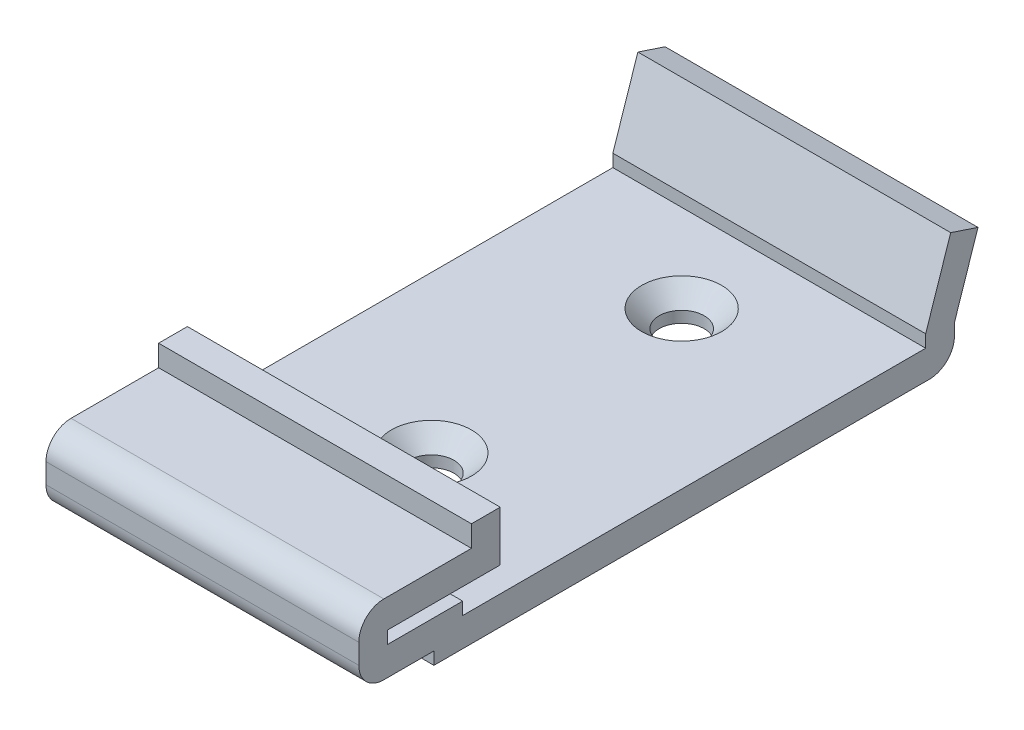
ISO-10303-21;
HEADER;
FILE_DESCRIPTION(('STEP AP214'),'2;1');
FILE_NAME('part.step','',(''),(''),'','','');
FILE_SCHEMA(('AUTOMOTIVE_DESIGN { 1 0 10303 214 1 1 1 1 }'));
ENDSEC;
DATA;
#1=APPLICATION_CONTEXT('core data for automotive mechanical design processes');
#2=APPLICATION_PROTOCOL_DEFINITION('international standard','automotive_design',2000,#1);
#3=PRODUCT_CONTEXT('',#1,'mechanical');
#4=PRODUCT('Part','Part','',(#3));
#5=PRODUCT_RELATED_PRODUCT_CATEGORY('part','',(#4));
#6=PRODUCT_DEFINITION_FORMATION('','',#4);
#7=PRODUCT_DEFINITION_CONTEXT('part definition',#1,'design');
#8=PRODUCT_DEFINITION('design','',#6,#7);
#9=PRODUCT_DEFINITION_SHAPE('','',#8);
#10=(LENGTH_UNIT() NAMED_UNIT(*) SI_UNIT(.MILLI.,.METRE.));
#11=(NAMED_UNIT(*) PLANE_ANGLE_UNIT() SI_UNIT($,.RADIAN.));
#12=(NAMED_UNIT(*) SI_UNIT($,.STERADIAN.) SOLID_ANGLE_UNIT());
#13=UNCERTAINTY_MEASURE_WITH_UNIT(LENGTH_MEASURE(1.E-05),#10,'distance_accuracy_value','');
#14=(GEOMETRIC_REPRESENTATION_CONTEXT(3) GLOBAL_UNCERTAINTY_ASSIGNED_CONTEXT((#13)) GLOBAL_UNIT_ASSIGNED_CONTEXT((#10,
#11,#12)) REPRESENTATION_CONTEXT('',''));
#15=CARTESIAN_POINT('',(0.,0.,0.));
#16=DIRECTION('',(0.,0.,1.));
#17=DIRECTION('',(1.,0.,0.));
#18=AXIS2_PLACEMENT_3D('',#15,#16,#17);
#19=CARTESIAN_POINT('',(5.,4.,0.));
#20=DIRECTION('',(0.,-1.,0.));
#21=DIRECTION('',(0.,0.,-1.));
#22=AXIS2_PLACEMENT_3D('',#19,#20,#21);
#23=PLANE('',#22);
#24=DIRECTION('',(0.,0.,1.));
#25=VECTOR('',#24,1.);
#26=CARTESIAN_POINT('',(-5.,4.,0.));
#27=LINE('',#26,#25);
#28=CARTESIAN_POINT('',(-5.,4.,0.));
#29=VERTEX_POINT('',#28);
#30=CARTESIAN_POINT('',(-5.,4.,2.3));
#31=VERTEX_POINT('',#30);
#32=EDGE_CURVE('E264',#29,#31,#27,.T.);
#33=ORIENTED_EDGE('',*,*,#32,.T.);
#34=DIRECTION('',(-1.,0.,0.));
#35=VECTOR('',#34,1.);
#36=CARTESIAN_POINT('',(5.,4.,2.3));
#37=LINE('',#36,#35);
#38=CARTESIAN_POINT('',(20.,4.,2.3));
#39=VERTEX_POINT('',#38);
#40=EDGE_CURVE('E336',#39,#31,#37,.T.);
#41=ORIENTED_EDGE('',*,*,#40,.F.);
#42=DIRECTION('',(0.,0.,1.));
#43=VECTOR('',#42,1.);
#44=CARTESIAN_POINT('',(20.,4.,0.));
#45=LINE('',#44,#43);
#46=CARTESIAN_POINT('',(20.,4.,0.));
#47=VERTEX_POINT('',#46);
#48=EDGE_CURVE('E246',#47,#39,#45,.T.);
#49=ORIENTED_EDGE('',*,*,#48,.F.);
#50=DIRECTION('',(-1.,0.,0.));
#51=VECTOR('',#50,1.);
#52=CARTESIAN_POINT('',(5.,4.,0.));
#53=LINE('',#52,#51);
#54=EDGE_CURVE('E300',#47,#29,#53,.T.);
#55=ORIENTED_EDGE('',*,*,#54,.T.);
#56=EDGE_LOOP('',(#33,#41,#49,#55));
#57=FACE_BOUND('',#56,.T.);
#58=ADVANCED_FACE('F34',(#57),#23,.F.);
#59=CARTESIAN_POINT('',(5.,4.,2.3));
#60=DIRECTION('',(0.,0.,-1.));
#61=DIRECTION('',(-1.,0.,0.));
#62=AXIS2_PLACEMENT_3D('',#59,#60,#61);
#63=PLANE('',#62);
#64=DIRECTION('',(0.,-1.,0.));
#65=VECTOR('',#64,1.);
#66=CARTESIAN_POINT('',(-5.,4.,2.3));
#67=LINE('',#66,#65);
#68=CARTESIAN_POINT('',(-5.,2.3,2.3));
#69=VERTEX_POINT('',#68);
#70=EDGE_CURVE('E267',#31,#69,#67,.T.);
#71=ORIENTED_EDGE('',*,*,#70,.T.);
#72=DIRECTION('',(-1.,0.,0.));
#73=VECTOR('',#72,1.);
#74=CARTESIAN_POINT('',(5.,2.3,2.3));
#75=LINE('',#74,#73);
#76=CARTESIAN_POINT('',(20.,2.3,2.3));
#77=VERTEX_POINT('',#76);
#78=EDGE_CURVE('E333',#77,#69,#75,.T.);
#79=ORIENTED_EDGE('',*,*,#78,.F.);
#80=DIRECTION('',(0.,-1.,0.));
#81=VECTOR('',#80,1.);
#82=CARTESIAN_POINT('',(20.,4.,2.3));
#83=LINE('',#82,#81);
#84=EDGE_CURVE('E249',#39,#77,#83,.T.);
#85=ORIENTED_EDGE('',*,*,#84,.F.);
#86=ORIENTED_EDGE('',*,*,#40,.T.);
#87=EDGE_LOOP('',(#71,#79,#85,#86));
#88=FACE_BOUND('',#87,.T.);
#89=ADVANCED_FACE('F415',(#88),#63,.F.);
#90=CARTESIAN_POINT('',(5.,2.3,2.3));
#91=DIRECTION('',(0.,-1.,0.));
#92=DIRECTION('',(0.,0.,-1.));
#93=AXIS2_PLACEMENT_3D('',#90,#91,#92);
#94=PLANE('',#93);
#95=DIRECTION('',(0.,0.,1.));
#96=VECTOR('',#95,1.);
#97=CARTESIAN_POINT('',(-5.,2.3,2.3));
#98=LINE('',#97,#96);
#99=CARTESIAN_POINT('',(-5.,2.3,9.3));
#100=VERTEX_POINT('',#99);
#101=EDGE_CURVE('E269',#69,#100,#98,.T.);
#102=ORIENTED_EDGE('',*,*,#101,.T.);
#103=DIRECTION('',(-1.,0.,0.));
#104=VECTOR('',#103,1.);
#105=CARTESIAN_POINT('',(5.,2.3,9.3));
#106=LINE('',#105,#104);
#107=CARTESIAN_POINT('',(20.,2.3,9.3));
#108=VERTEX_POINT('',#107);
#109=EDGE_CURVE('E11',#100,#108,#106,.F.);
#110=ORIENTED_EDGE('',*,*,#109,.T.);
#111=DIRECTION('',(0.,0.,1.));
#112=VECTOR('',#111,1.);
#113=CARTESIAN_POINT('',(20.,2.3,2.3));
#114=LINE('',#113,#112);
#115=EDGE_CURVE('E252',#77,#108,#114,.T.);
#116=ORIENTED_EDGE('',*,*,#115,.F.);
#117=ORIENTED_EDGE('',*,*,#78,.T.);
#118=EDGE_LOOP('',(#102,#110,#116,#117));
#119=FACE_BOUND('',#118,.T.);
#120=ADVANCED_FACE('F417',(#119),#94,.F.);
#121=CARTESIAN_POINT('',(5.,2.3,11.3));
#122=DIRECTION('',(0.,0.,-1.));
#123=DIRECTION('',(-1.,0.,0.));
#124=AXIS2_PLACEMENT_3D('',#121,#122,#123);
#125=PLANE('',#124);
#126=DIRECTION('',(0.,-1.,0.));
#127=VECTOR('',#126,1.);
#128=CARTESIAN_POINT('',(-5.,2.3,11.3));
#129=LINE('',#128,#127);
#130=CARTESIAN_POINT('',(-5.,0.3,11.3));
#131=VERTEX_POINT('',#130);
#132=CARTESIAN_POINT('',(-5.,-1.3,11.3));
#133=VERTEX_POINT('',#132);
#134=EDGE_CURVE('E271',#131,#133,#129,.T.);
#135=ORIENTED_EDGE('',*,*,#134,.T.);
#136=DIRECTION('',(-1.,0.,0.));
#137=VECTOR('',#136,1.);
#138=CARTESIAN_POINT('',(5.,-1.3,11.3));
#139=LINE('',#138,#137);
#140=CARTESIAN_POINT('',(20.,-1.3,11.3));
#141=VERTEX_POINT('',#140);
#142=EDGE_CURVE('E42',#133,#141,#139,.F.);
#143=ORIENTED_EDGE('',*,*,#142,.T.);
#144=DIRECTION('',(0.,-1.,0.));
#145=VECTOR('',#144,1.);
#146=CARTESIAN_POINT('',(20.,0.3,11.3));
#147=LINE('',#146,#145);
#148=CARTESIAN_POINT('',(20.,0.3,11.3));
#149=VERTEX_POINT('',#148);
#150=EDGE_CURVE('E258',#149,#141,#147,.T.);
#151=ORIENTED_EDGE('',*,*,#150,.F.);
#152=DIRECTION('',(-1.,0.,0.));
#153=VECTOR('',#152,1.);
#154=CARTESIAN_POINT('',(5.,0.3,11.3));
#155=LINE('',#154,#153);
#156=EDGE_CURVE('E350',#149,#131,#155,.T.);
#157=ORIENTED_EDGE('',*,*,#156,.T.);
#158=EDGE_LOOP('',(#135,#143,#151,#157));
#159=FACE_BOUND('',#158,.T.);
#160=ADVANCED_FACE('F355',(#159),#125,.F.);
#161=CARTESIAN_POINT('',(5.,-3.3,11.3));
#162=DIRECTION('',(0.,1.,0.));
#163=DIRECTION('',(0.,0.,1.));
#164=AXIS2_PLACEMENT_3D('',#161,#162,#163);
#165=PLANE('',#164);
#166=DIRECTION('',(-1.,0.,0.));
#167=VECTOR('',#166,1.);
#168=CARTESIAN_POINT('',(5.,-3.3,5.3));
#169=LINE('',#168,#167);
#170=CARTESIAN_POINT('',(20.,-3.3,5.3));
#171=VERTEX_POINT('',#170);
#172=CARTESIAN_POINT('',(-5.,-3.3,5.3));
#173=VERTEX_POINT('',#172);
#174=EDGE_CURVE('E187',#171,#173,#169,.T.);
#175=ORIENTED_EDGE('',*,*,#174,.F.);
#176=DIRECTION('',(0.,0.,-1.));
#177=VECTOR('',#176,1.);
#178=CARTESIAN_POINT('',(20.,-3.3,9.3));
#179=LINE('',#178,#177);
#180=CARTESIAN_POINT('',(20.,-3.3,9.3));
#181=VERTEX_POINT('',#180);
#182=EDGE_CURVE('E204',#181,#171,#179,.T.);
#183=ORIENTED_EDGE('',*,*,#182,.F.);
#184=DIRECTION('',(-1.,0.,0.));
#185=VECTOR('',#184,1.);
#186=CARTESIAN_POINT('',(5.,-3.3,9.3));
#187=LINE('',#186,#185);
#188=CARTESIAN_POINT('',(-5.,-3.3,9.3));
#189=VERTEX_POINT('',#188);
#190=EDGE_CURVE('E347',#181,#189,#187,.T.);
#191=ORIENTED_EDGE('',*,*,#190,.T.);
#192=DIRECTION('',(0.,0.,-1.));
#193=VECTOR('',#192,1.);
#194=CARTESIAN_POINT('',(-5.,-3.3,11.3));
#195=LINE('',#194,#193);
#196=EDGE_CURVE('E273',#189,#173,#195,.T.);
#197=ORIENTED_EDGE('',*,*,#196,.T.);
#198=EDGE_LOOP('',(#175,#183,#191,#197));
#199=FACE_BOUND('',#198,.T.);
#200=ADVANCED_FACE('F361',(#199),#165,.F.);
#201=CARTESIAN_POINT('',(5.,-3.3,5.3));
#202=DIRECTION('',(0.,0.,-1.));
#203=DIRECTION('',(-1.,0.,0.));
#204=AXIS2_PLACEMENT_3D('',#201,#202,#203);
#205=PLANE('',#204);
#206=DIRECTION('',(0.,-1.,0.));
#207=VECTOR('',#206,1.);
#208=CARTESIAN_POINT('',(-5.,-3.3,5.3));
#209=LINE('',#208,#207);
#210=CARTESIAN_POINT('',(-5.,-4.3,5.3));
#211=VERTEX_POINT('',#210);
#212=EDGE_CURVE('E183',#173,#211,#209,.T.);
#213=ORIENTED_EDGE('',*,*,#212,.T.);
#214=DIRECTION('',(-1.,0.,0.));
#215=VECTOR('',#214,1.);
#216=CARTESIAN_POINT('',(5.,-4.3,5.3));
#217=LINE('',#216,#215);
#218=CARTESIAN_POINT('',(20.,-4.3,5.3));
#219=VERTEX_POINT('',#218);
#220=EDGE_CURVE('E176',#219,#211,#217,.T.);
#221=ORIENTED_EDGE('',*,*,#220,.F.);
#222=DIRECTION('',(0.,-1.,0.));
#223=VECTOR('',#222,1.);
#224=CARTESIAN_POINT('',(20.,-3.3,5.3));
#225=LINE('',#224,#223);
#226=EDGE_CURVE('E181',#171,#219,#225,.T.);
#227=ORIENTED_EDGE('',*,*,#226,.F.);
#228=ORIENTED_EDGE('',*,*,#174,.T.);
#229=EDGE_LOOP('',(#213,#221,#227,#228));
#230=FACE_BOUND('',#229,.T.);
#231=ADVANCED_FACE('F178',(#230),#205,.F.);
#232=CARTESIAN_POINT('',(5.,-4.3,5.3));
#233=DIRECTION('',(0.,1.,0.));
#234=DIRECTION('',(0.,0.,1.));
#235=AXIS2_PLACEMENT_3D('',#232,#233,#234);
#236=PLANE('',#235);
#237=CARTESIAN_POINT('',(7.5,-4.3,-27.));
#238=DIRECTION('',(0.,1.,0.));
#239=DIRECTION('',(0.,0.,1.));
#240=AXIS2_PLACEMENT_3D('',#237,#238,#239);
#241=CIRCLE('',#240,1.8);
#242=CARTESIAN_POINT('',(7.5,-4.3,-25.2));
#243=VERTEX_POINT('',#242);
#244=EDGE_CURVE('E614',#243,#243,#241,.T.);
#245=ORIENTED_EDGE('',*,*,#244,.T.);
#246=EDGE_LOOP('',(#245));
#247=FACE_BOUND('',#246,.T.);
#248=CARTESIAN_POINT('',(7.5,-4.3,-7.));
#249=DIRECTION('',(0.,1.,0.));
#250=DIRECTION('',(0.,0.,1.));
#251=AXIS2_PLACEMENT_3D('',#248,#249,#250);
#252=CIRCLE('',#251,1.8);
#253=CARTESIAN_POINT('',(7.5,-4.3,-5.2));
#254=VERTEX_POINT('',#253);
#255=EDGE_CURVE('E205',#254,#254,#252,.T.);
#256=ORIENTED_EDGE('',*,*,#255,.T.);
#257=EDGE_LOOP('',(#256));
#258=FACE_BOUND('',#257,.T.);
#259=DIRECTION('',(0.,0.,-1.));
#260=VECTOR('',#259,1.);
#261=CARTESIAN_POINT('',(-5.,-4.3,5.3));
#262=LINE('',#261,#260);
#263=CARTESIAN_POINT('',(-5.,-4.3,-34.3));
#264=VERTEX_POINT('',#263);
#265=EDGE_CURVE('E276',#211,#264,#262,.T.);
#266=ORIENTED_EDGE('',*,*,#265,.T.);
#267=DIRECTION('',(-1.,0.,0.));
#268=VECTOR('',#267,1.);
#269=CARTESIAN_POINT('',(5.,-4.3,-34.3));
#270=LINE('',#269,#268);
#271=CARTESIAN_POINT('',(20.,-4.3,-34.3));
#272=VERTEX_POINT('',#271);
#273=EDGE_CURVE('E194',#264,#272,#270,.F.);
#274=ORIENTED_EDGE('',*,*,#273,.T.);
#275=DIRECTION('',(0.,0.,-1.));
#276=VECTOR('',#275,1.);
#277=CARTESIAN_POINT('',(20.,-4.3,5.3));
#278=LINE('',#277,#276);
#279=EDGE_CURVE('E191',#219,#272,#278,.T.);
#280=ORIENTED_EDGE('',*,*,#279,.F.);
#281=ORIENTED_EDGE('',*,*,#220,.T.);
#282=EDGE_LOOP('',(#266,#274,#280,#281));
#283=FACE_BOUND('',#282,.T.);
#284=ADVANCED_FACE('F192',(#247,#258,#283),#236,.F.);
#285=CARTESIAN_POINT('',(5.,-4.3,-36.3));
#286=DIRECTION('',(0.,0.,1.));
#287=DIRECTION('',(1.,0.,0.));
#288=AXIS2_PLACEMENT_3D('',#285,#286,#287);
#289=PLANE('',#288);
#290=DIRECTION('',(-1.,0.,0.));
#291=VECTOR('',#290,1.);
#292=CARTESIAN_POINT('',(5.,-1.37323861838728,-36.3));
#293=LINE('',#292,#291);
#294=CARTESIAN_POINT('',(20.,-1.37323861838728,-36.3));
#295=VERTEX_POINT('',#294);
#296=CARTESIAN_POINT('',(-5.,-1.37323861838728,-36.3));
#297=VERTEX_POINT('',#296);
#298=EDGE_CURVE('E188',#295,#297,#293,.T.);
#299=ORIENTED_EDGE('',*,*,#298,.F.);
#300=DIRECTION('',(0.,1.,0.));
#301=VECTOR('',#300,1.);
#302=CARTESIAN_POINT('',(20.,-2.3,-36.3));
#303=LINE('',#302,#301);
#304=CARTESIAN_POINT('',(20.,-2.3,-36.3));
#305=VERTEX_POINT('',#304);
#306=EDGE_CURVE('E213',#305,#295,#303,.T.);
#307=ORIENTED_EDGE('',*,*,#306,.F.);
#308=DIRECTION('',(-1.,0.,0.));
#309=VECTOR('',#308,1.);
#310=CARTESIAN_POINT('',(5.,-2.3,-36.3));
#311=LINE('',#310,#309);
#312=CARTESIAN_POINT('',(-5.,-2.3,-36.3));
#313=VERTEX_POINT('',#312);
#314=EDGE_CURVE('E339',#305,#313,#311,.T.);
#315=ORIENTED_EDGE('',*,*,#314,.T.);
#316=DIRECTION('',(0.,1.,0.));
#317=VECTOR('',#316,1.);
#318=CARTESIAN_POINT('',(-5.,-4.3,-36.3));
#319=LINE('',#318,#317);
#320=EDGE_CURVE('E278',#313,#297,#319,.T.);
#321=ORIENTED_EDGE('',*,*,#320,.T.);
#322=EDGE_LOOP('',(#299,#307,#315,#321));
#323=FACE_BOUND('',#322,.T.);
#324=ADVANCED_FACE('F369',(#323),#289,.F.);
#325=CARTESIAN_POINT('',(5.,-1.37323861838728,-36.3));
#326=DIRECTION('',(0.,0.316227766016838,0.948683298050514));
#327=DIRECTION('',(0.,-0.948683298050514,0.316227766016838));
#328=AXIS2_PLACEMENT_3D('',#325,#326,#327);
#329=PLANE('',#328);
#330=DIRECTION('',(0.,0.948683298050514,-0.316227766016838));
#331=VECTOR('',#330,1.);
#332=CARTESIAN_POINT('',(-5.,-1.37323861838728,-36.3));
#333=LINE('',#332,#331);
#334=CARTESIAN_POINT('',(-5.,4.27267613816128,-38.1819715855162));
#335=VERTEX_POINT('',#334);
#336=EDGE_CURVE('E280',#297,#335,#333,.T.);
#337=ORIENTED_EDGE('',*,*,#336,.T.);
#338=DIRECTION('',(-1.,0.,0.));
#339=VECTOR('',#338,1.);
#340=CARTESIAN_POINT('',(5.,4.27267613816128,-38.1819715855162));
#341=LINE('',#340,#339);
#342=CARTESIAN_POINT('',(20.,4.27267613816128,-38.1819715855162));
#343=VERTEX_POINT('',#342);
#344=EDGE_CURVE('E327',#343,#335,#341,.T.);
#345=ORIENTED_EDGE('',*,*,#344,.F.);
#346=DIRECTION('',(0.,0.948683298050514,-0.316227766016838));
#347=VECTOR('',#346,1.);
#348=CARTESIAN_POINT('',(20.,-1.37323861838728,-36.3));
#349=LINE('',#348,#347);
#350=EDGE_CURVE('E216',#295,#343,#349,.T.);
#351=ORIENTED_EDGE('',*,*,#350,.F.);
#352=ORIENTED_EDGE('',*,*,#298,.T.);
#353=EDGE_LOOP('',(#337,#345,#351,#352));
#354=FACE_BOUND('',#353,.T.);
#355=ADVANCED_FACE('F372',(#354),#329,.F.);
#356=CARTESIAN_POINT('',(5.,5.,-36.));
#357=DIRECTION('',(0.,-0.948683298050515,0.316227766016834));
#358=DIRECTION('',(0.,-0.316227766016834,-0.948683298050515));
#359=AXIS2_PLACEMENT_3D('',#356,#357,#358);
#360=PLANE('',#359);
#361=DIRECTION('',(0.,0.316227766016834,0.948683298050515));
#362=VECTOR('',#361,1.);
#363=CARTESIAN_POINT('',(-5.,5.,-36.));
#364=LINE('',#363,#362);
#365=CARTESIAN_POINT('',(-5.,5.,-36.));
#366=VERTEX_POINT('',#365);
#367=EDGE_CURVE('E282',#335,#366,#364,.T.);
#368=ORIENTED_EDGE('',*,*,#367,.T.);
#369=DIRECTION('',(-1.,0.,0.));
#370=VECTOR('',#369,1.);
#371=CARTESIAN_POINT('',(5.,5.,-36.));
#372=LINE('',#371,#370);
#373=CARTESIAN_POINT('',(20.,5.,-36.));
#374=VERTEX_POINT('',#373);
#375=EDGE_CURVE('E324',#374,#366,#372,.T.);
#376=ORIENTED_EDGE('',*,*,#375,.F.);
#377=DIRECTION('',(0.,0.316227766016834,0.948683298050515));
#378=VECTOR('',#377,1.);
#379=CARTESIAN_POINT('',(20.,4.27267613816128,-38.1819715855162));
#380=LINE('',#379,#378);
#381=EDGE_CURVE('E219',#343,#374,#380,.T.);
#382=ORIENTED_EDGE('',*,*,#381,.F.);
#383=ORIENTED_EDGE('',*,*,#344,.T.);
#384=EDGE_LOOP('',(#368,#376,#382,#383));
#385=FACE_BOUND('',#384,.T.);
#386=ADVANCED_FACE('F377',(#385),#360,.F.);
#387=CARTESIAN_POINT('',(5.,-1.,-34.));
#388=DIRECTION('',(0.,-0.316227766016838,-0.948683298050514));
#389=DIRECTION('',(0.,0.948683298050514,-0.316227766016838));
#390=AXIS2_PLACEMENT_3D('',#387,#388,#389);
#391=PLANE('',#390);
#392=DIRECTION('',(0.,-0.948683298050514,0.316227766016838));
#393=VECTOR('',#392,1.);
#394=CARTESIAN_POINT('',(-5.,-1.,-34.));
#395=LINE('',#394,#393);
#396=CARTESIAN_POINT('',(-5.,-1.,-34.));
#397=VERTEX_POINT('',#396);
#398=EDGE_CURVE('E284',#366,#397,#395,.T.);
#399=ORIENTED_EDGE('',*,*,#398,.T.);
#400=DIRECTION('',(-1.,0.,0.));
#401=VECTOR('',#400,1.);
#402=CARTESIAN_POINT('',(5.,-1.,-34.));
#403=LINE('',#402,#401);
#404=CARTESIAN_POINT('',(20.,-1.,-34.));
#405=VERTEX_POINT('',#404);
#406=EDGE_CURVE('E321',#405,#397,#403,.T.);
#407=ORIENTED_EDGE('',*,*,#406,.F.);
#408=DIRECTION('',(0.,-0.948683298050514,0.316227766016838));
#409=VECTOR('',#408,1.);
#410=CARTESIAN_POINT('',(20.,5.,-36.));
#411=LINE('',#410,#409);
#412=EDGE_CURVE('E222',#374,#405,#411,.T.);
#413=ORIENTED_EDGE('',*,*,#412,.F.);
#414=ORIENTED_EDGE('',*,*,#375,.T.);
#415=EDGE_LOOP('',(#399,#407,#413,#414));
#416=FACE_BOUND('',#415,.T.);
#417=ADVANCED_FACE('F381',(#416),#391,.F.);
#418=CARTESIAN_POINT('',(5.,-2.,-34.));
#419=DIRECTION('',(0.,0.,-1.));
#420=DIRECTION('',(-1.,0.,0.));
#421=AXIS2_PLACEMENT_3D('',#418,#419,#420);
#422=PLANE('',#421);
#423=DIRECTION('',(0.,-1.,0.));
#424=VECTOR('',#423,1.);
#425=CARTESIAN_POINT('',(-5.,-2.,-34.));
#426=LINE('',#425,#424);
#427=CARTESIAN_POINT('',(-5.,-2.,-34.));
#428=VERTEX_POINT('',#427);
#429=EDGE_CURVE('E286',#397,#428,#426,.T.);
#430=ORIENTED_EDGE('',*,*,#429,.T.);
#431=DIRECTION('',(-1.,0.,0.));
#432=VECTOR('',#431,1.);
#433=CARTESIAN_POINT('',(5.,-2.,-34.));
#434=LINE('',#433,#432);
#435=CARTESIAN_POINT('',(20.,-2.,-34.));
#436=VERTEX_POINT('',#435);
#437=EDGE_CURVE('E318',#436,#428,#434,.T.);
#438=ORIENTED_EDGE('',*,*,#437,.F.);
#439=DIRECTION('',(0.,-1.,0.));
#440=VECTOR('',#439,1.);
#441=CARTESIAN_POINT('',(20.,-1.,-34.));
#442=LINE('',#441,#440);
#443=EDGE_CURVE('E225',#405,#436,#442,.T.);
#444=ORIENTED_EDGE('',*,*,#443,.F.);
#445=ORIENTED_EDGE('',*,*,#406,.T.);
#446=EDGE_LOOP('',(#430,#438,#444,#445));
#447=FACE_BOUND('',#446,.T.);
#448=ADVANCED_FACE('F385',(#447),#422,.F.);
#449=CARTESIAN_POINT('',(5.,-2.,3.));
#450=DIRECTION('',(0.,-1.,0.));
#451=DIRECTION('',(0.,0.,-1.));
#452=AXIS2_PLACEMENT_3D('',#449,#450,#451);
#453=PLANE('',#452);
#454=CARTESIAN_POINT('',(7.5,-2.,-27.));
#455=DIRECTION('',(0.,1.,0.));
#456=DIRECTION('',(0.,0.,1.));
#457=AXIS2_PLACEMENT_3D('',#454,#455,#456);
#458=CIRCLE('',#457,3.2);
#459=CARTESIAN_POINT('',(7.5,-2.,-23.8));
#460=VERTEX_POINT('',#459);
#461=EDGE_CURVE('E612',#460,#460,#458,.T.);
#462=ORIENTED_EDGE('',*,*,#461,.F.);
#463=EDGE_LOOP('',(#462));
#464=FACE_BOUND('',#463,.T.);
#465=CARTESIAN_POINT('',(7.5,-2.,-7.));
#466=DIRECTION('',(0.,1.,0.));
#467=DIRECTION('',(0.,0.,1.));
#468=AXIS2_PLACEMENT_3D('',#465,#466,#467);
#469=CIRCLE('',#468,3.2);
#470=CARTESIAN_POINT('',(7.5,-2.,-3.8));
#471=VERTEX_POINT('',#470);
#472=EDGE_CURVE('E619',#471,#471,#469,.T.);
#473=ORIENTED_EDGE('',*,*,#472,.F.);
#474=EDGE_LOOP('',(#473));
#475=FACE_BOUND('',#474,.T.);
#476=DIRECTION('',(0.,0.,1.));
#477=VECTOR('',#476,1.);
#478=CARTESIAN_POINT('',(-5.,-2.,3.));
#479=LINE('',#478,#477);
#480=CARTESIAN_POINT('',(-5.,-2.,3.));
#481=VERTEX_POINT('',#480);
#482=EDGE_CURVE('E288',#428,#481,#479,.T.);
#483=ORIENTED_EDGE('',*,*,#482,.T.);
#484=DIRECTION('',(-1.,0.,0.));
#485=VECTOR('',#484,1.);
#486=CARTESIAN_POINT('',(5.,-2.,3.));
#487=LINE('',#486,#485);
#488=CARTESIAN_POINT('',(20.,-2.,3.));
#489=VERTEX_POINT('',#488);
#490=EDGE_CURVE('E315',#489,#481,#487,.T.);
#491=ORIENTED_EDGE('',*,*,#490,.F.);
#492=DIRECTION('',(0.,0.,1.));
#493=VECTOR('',#492,1.);
#494=CARTESIAN_POINT('',(20.,-2.,-34.));
#495=LINE('',#494,#493);
#496=EDGE_CURVE('E228',#436,#489,#495,.T.);
#497=ORIENTED_EDGE('',*,*,#496,.F.);
#498=ORIENTED_EDGE('',*,*,#437,.T.);
#499=EDGE_LOOP('',(#483,#491,#497,#498));
#500=FACE_BOUND('',#499,.T.);
#501=ADVANCED_FACE('F388',(#464,#475,#500),#453,.F.);
#502=CARTESIAN_POINT('',(5.,-1.,3.));
#503=DIRECTION('',(0.,0.,1.));
#504=DIRECTION('',(0.,-1.,0.));
#505=AXIS2_PLACEMENT_3D('',#502,#503,#504);
#506=PLANE('',#505);
#507=DIRECTION('',(0.,1.,0.));
#508=VECTOR('',#507,1.);
#509=CARTESIAN_POINT('',(-5.,-1.,3.));
#510=LINE('',#509,#508);
#511=CARTESIAN_POINT('',(-5.,-1.,3.));
#512=VERTEX_POINT('',#511);
#513=EDGE_CURVE('E290',#481,#512,#510,.T.);
#514=ORIENTED_EDGE('',*,*,#513,.T.);
#515=DIRECTION('',(-1.,0.,0.));
#516=VECTOR('',#515,1.);
#517=CARTESIAN_POINT('',(5.,-1.,3.));
#518=LINE('',#517,#516);
#519=CARTESIAN_POINT('',(20.,-1.,3.));
#520=VERTEX_POINT('',#519);
#521=EDGE_CURVE('E312',#520,#512,#518,.T.);
#522=ORIENTED_EDGE('',*,*,#521,.F.);
#523=DIRECTION('',(0.,1.,0.));
#524=VECTOR('',#523,1.);
#525=CARTESIAN_POINT('',(20.,-2.,3.));
#526=LINE('',#525,#524);
#527=EDGE_CURVE('E231',#489,#520,#526,.T.);
#528=ORIENTED_EDGE('',*,*,#527,.F.);
#529=ORIENTED_EDGE('',*,*,#490,.T.);
#530=EDGE_LOOP('',(#514,#522,#528,#529));
#531=FACE_BOUND('',#530,.T.);
#532=ADVANCED_FACE('F393',(#531),#506,.F.);
#533=CARTESIAN_POINT('',(5.,-1.,9.));
#534=DIRECTION('',(0.,-1.,0.));
#535=DIRECTION('',(0.,0.,-1.));
#536=AXIS2_PLACEMENT_3D('',#533,#534,#535);
#537=PLANE('',#536);
#538=DIRECTION('',(0.,0.,1.));
#539=VECTOR('',#538,1.);
#540=CARTESIAN_POINT('',(-5.,-1.,9.));
#541=LINE('',#540,#539);
#542=CARTESIAN_POINT('',(-5.,-1.,9.));
#543=VERTEX_POINT('',#542);
#544=EDGE_CURVE('E292',#512,#543,#541,.T.);
#545=ORIENTED_EDGE('',*,*,#544,.T.);
#546=DIRECTION('',(-1.,0.,0.));
#547=VECTOR('',#546,1.);
#548=CARTESIAN_POINT('',(5.,-1.,9.));
#549=LINE('',#548,#547);
#550=CARTESIAN_POINT('',(20.,-1.,9.));
#551=VERTEX_POINT('',#550);
#552=EDGE_CURVE('E309',#551,#543,#549,.T.);
#553=ORIENTED_EDGE('',*,*,#552,.F.);
#554=DIRECTION('',(0.,0.,1.));
#555=VECTOR('',#554,1.);
#556=CARTESIAN_POINT('',(20.,-1.,3.));
#557=LINE('',#556,#555);
#558=EDGE_CURVE('E234',#520,#551,#557,.T.);
#559=ORIENTED_EDGE('',*,*,#558,.F.);
#560=ORIENTED_EDGE('',*,*,#521,.T.);
#561=EDGE_LOOP('',(#545,#553,#559,#560));
#562=FACE_BOUND('',#561,.T.);
#563=ADVANCED_FACE('F397',(#562),#537,.F.);
#564=CARTESIAN_POINT('',(5.,0.,9.));
#565=DIRECTION('',(0.,0.,1.));
#566=DIRECTION('',(0.,-1.,0.));
#567=AXIS2_PLACEMENT_3D('',#564,#565,#566);
#568=PLANE('',#567);
#569=DIRECTION('',(0.,1.,0.));
#570=VECTOR('',#569,1.);
#571=CARTESIAN_POINT('',(-5.,0.,9.));
#572=LINE('',#571,#570);
#573=CARTESIAN_POINT('',(-5.,0.,9.));
#574=VERTEX_POINT('',#573);
#575=EDGE_CURVE('E294',#543,#574,#572,.T.);
#576=ORIENTED_EDGE('',*,*,#575,.T.);
#577=DIRECTION('',(-1.,0.,0.));
#578=VECTOR('',#577,1.);
#579=CARTESIAN_POINT('',(5.,0.,9.));
#580=LINE('',#579,#578);
#581=CARTESIAN_POINT('',(20.,0.,9.));
#582=VERTEX_POINT('',#581);
#583=EDGE_CURVE('E306',#582,#574,#580,.T.);
#584=ORIENTED_EDGE('',*,*,#583,.F.);
#585=DIRECTION('',(0.,1.,0.));
#586=VECTOR('',#585,1.);
#587=CARTESIAN_POINT('',(20.,-1.,9.));
#588=LINE('',#587,#586);
#589=EDGE_CURVE('E237',#551,#582,#588,.T.);
#590=ORIENTED_EDGE('',*,*,#589,.F.);
#591=ORIENTED_EDGE('',*,*,#552,.T.);
#592=EDGE_LOOP('',(#576,#584,#590,#591));
#593=FACE_BOUND('',#592,.T.);
#594=ADVANCED_FACE('F401',(#593),#568,.F.);
#595=CARTESIAN_POINT('',(5.,0.,0.));
#596=DIRECTION('',(0.,1.,0.));
#597=DIRECTION('',(0.,0.,1.));
#598=AXIS2_PLACEMENT_3D('',#595,#596,#597);
#599=PLANE('',#598);
#600=DIRECTION('',(0.,0.,-1.));
#601=VECTOR('',#600,1.);
#602=CARTESIAN_POINT('',(-5.,0.,0.));
#603=LINE('',#602,#601);
#604=CARTESIAN_POINT('',(-5.,0.,0.));
#605=VERTEX_POINT('',#604);
#606=EDGE_CURVE('E296',#574,#605,#603,.T.);
#607=ORIENTED_EDGE('',*,*,#606,.T.);
#608=DIRECTION('',(-1.,0.,0.));
#609=VECTOR('',#608,1.);
#610=CARTESIAN_POINT('',(5.,0.,0.));
#611=LINE('',#610,#609);
#612=CARTESIAN_POINT('',(20.,0.,0.));
#613=VERTEX_POINT('',#612);
#614=EDGE_CURVE('E303',#613,#605,#611,.T.);
#615=ORIENTED_EDGE('',*,*,#614,.F.);
#616=DIRECTION('',(0.,0.,-1.));
#617=VECTOR('',#616,1.);
#618=CARTESIAN_POINT('',(20.,0.,9.));
#619=LINE('',#618,#617);
#620=EDGE_CURVE('E240',#582,#613,#619,.T.);
#621=ORIENTED_EDGE('',*,*,#620,.F.);
#622=ORIENTED_EDGE('',*,*,#583,.T.);
#623=EDGE_LOOP('',(#607,#615,#621,#622));
#624=FACE_BOUND('',#623,.T.);
#625=ADVANCED_FACE('F404',(#624),#599,.F.);
#626=CARTESIAN_POINT('',(5.,4.,0.));
#627=DIRECTION('',(0.,0.,1.));
#628=DIRECTION('',(1.,0.,0.));
#629=AXIS2_PLACEMENT_3D('',#626,#627,#628);
#630=PLANE('',#629);
#631=DIRECTION('',(0.,1.,0.));
#632=VECTOR('',#631,1.);
#633=CARTESIAN_POINT('',(-5.,4.,0.));
#634=LINE('',#633,#632);
#635=EDGE_CURVE('E298',#605,#29,#634,.T.);
#636=ORIENTED_EDGE('',*,*,#635,.T.);
#637=ORIENTED_EDGE('',*,*,#54,.F.);
#638=DIRECTION('',(0.,1.,0.));
#639=VECTOR('',#638,1.);
#640=CARTESIAN_POINT('',(20.,0.,0.));
#641=LINE('',#640,#639);
#642=EDGE_CURVE('E243',#613,#47,#641,.T.);
#643=ORIENTED_EDGE('',*,*,#642,.F.);
#644=ORIENTED_EDGE('',*,*,#614,.T.);
#645=EDGE_LOOP('',(#636,#637,#643,#644));
#646=FACE_BOUND('',#645,.T.);
#647=ADVANCED_FACE('F408',(#646),#630,.F.);
#648=CARTESIAN_POINT('',(-5.,0.,0.));
#649=DIRECTION('',(1.,0.,0.));
#650=DIRECTION('',(0.,0.,-1.));
#651=AXIS2_PLACEMENT_3D('',#648,#649,#650);
#652=PLANE('',#651);
#653=ORIENTED_EDGE('',*,*,#320,.F.);
#654=CARTESIAN_POINT('',(-5.,-2.3,-34.3));
#655=DIRECTION('',(1.,0.,0.));
#656=DIRECTION('',(0.,0.,-1.));
#657=AXIS2_PLACEMENT_3D('',#654,#655,#656);
#658=CIRCLE('',#657,2.);
#659=EDGE_CURVE('E344',#313,#264,#658,.F.);
#660=ORIENTED_EDGE('',*,*,#659,.T.);
#661=ORIENTED_EDGE('',*,*,#265,.F.);
#662=ORIENTED_EDGE('',*,*,#212,.F.);
#663=ORIENTED_EDGE('',*,*,#196,.F.);
#664=CARTESIAN_POINT('',(-5.,-1.3,9.3));
#665=DIRECTION('',(1.,0.,0.));
#666=DIRECTION('',(0.,0.,-1.));
#667=AXIS2_PLACEMENT_3D('',#664,#665,#666);
#668=CIRCLE('',#667,2.);
#669=EDGE_CURVE('E55',#189,#133,#668,.F.);
#670=ORIENTED_EDGE('',*,*,#669,.T.);
#671=ORIENTED_EDGE('',*,*,#134,.F.);
#672=CARTESIAN_POINT('',(-5.,0.3,9.3));
#673=DIRECTION('',(1.,0.,0.));
#674=DIRECTION('',(0.,0.,-1.));
#675=AXIS2_PLACEMENT_3D('',#672,#673,#674);
#676=CIRCLE('',#675,2.);
#677=EDGE_CURVE('E49',#131,#100,#676,.F.);
#678=ORIENTED_EDGE('',*,*,#677,.T.);
#679=ORIENTED_EDGE('',*,*,#101,.F.);
#680=ORIENTED_EDGE('',*,*,#70,.F.);
#681=ORIENTED_EDGE('',*,*,#32,.F.);
#682=ORIENTED_EDGE('',*,*,#635,.F.);
#683=ORIENTED_EDGE('',*,*,#606,.F.);
#684=ORIENTED_EDGE('',*,*,#575,.F.);
#685=ORIENTED_EDGE('',*,*,#544,.F.);
#686=ORIENTED_EDGE('',*,*,#513,.F.);
#687=ORIENTED_EDGE('',*,*,#482,.F.);
#688=ORIENTED_EDGE('',*,*,#429,.F.);
#689=ORIENTED_EDGE('',*,*,#398,.F.);
#690=ORIENTED_EDGE('',*,*,#367,.F.);
#691=ORIENTED_EDGE('',*,*,#336,.F.);
#692=EDGE_LOOP('',(#653,#660,#661,#662,#663,#670,#671,#678,#679,#680,#681,#682,#683,#684,#685,
#686,#687,#688,#689,#690,#691));
#693=FACE_BOUND('',#692,.T.);
#694=ADVANCED_FACE('F363',(#693),#652,.F.);
#695=CARTESIAN_POINT('',(5.,-2.3,-34.3));
#696=DIRECTION('',(-1.,0.,0.));
#697=DIRECTION('',(0.,0.,1.));
#698=AXIS2_PLACEMENT_3D('',#695,#696,#697);
#699=CYLINDRICAL_SURFACE('',#698,2.);
#700=ORIENTED_EDGE('',*,*,#314,.F.);
#701=CARTESIAN_POINT('',(20.,-2.3,-34.3));
#702=DIRECTION('',(1.,0.,0.));
#703=DIRECTION('',(0.,0.,-1.));
#704=AXIS2_PLACEMENT_3D('',#701,#702,#703);
#705=CIRCLE('',#704,2.);
#706=EDGE_CURVE('E198',#272,#305,#705,.T.);
#707=ORIENTED_EDGE('',*,*,#706,.F.);
#708=ORIENTED_EDGE('',*,*,#273,.F.);
#709=ORIENTED_EDGE('',*,*,#659,.F.);
#710=EDGE_LOOP('',(#700,#707,#708,#709));
#711=FACE_BOUND('',#710,.T.);
#712=ADVANCED_FACE('F365',(#711),#699,.T.);
#713=CARTESIAN_POINT('',(5.,-1.3,9.3));
#714=DIRECTION('',(-1.,0.,0.));
#715=DIRECTION('',(0.,0.,1.));
#716=AXIS2_PLACEMENT_3D('',#713,#714,#715);
#717=CYLINDRICAL_SURFACE('',#716,2.);
#718=ORIENTED_EDGE('',*,*,#190,.F.);
#719=CARTESIAN_POINT('',(20.,-1.3,9.3));
#720=DIRECTION('',(1.,0.,0.));
#721=DIRECTION('',(0.,0.,-1.));
#722=AXIS2_PLACEMENT_3D('',#719,#720,#721);
#723=CIRCLE('',#722,2.);
#724=EDGE_CURVE('E261',#141,#181,#723,.T.);
#725=ORIENTED_EDGE('',*,*,#724,.F.);
#726=ORIENTED_EDGE('',*,*,#142,.F.);
#727=ORIENTED_EDGE('',*,*,#669,.F.);
#728=EDGE_LOOP('',(#718,#725,#726,#727));
#729=FACE_BOUND('',#728,.T.);
#730=ADVANCED_FACE('F359',(#729),#717,.T.);
#731=CARTESIAN_POINT('',(5.,0.3,9.3));
#732=DIRECTION('',(-1.,0.,0.));
#733=DIRECTION('',(0.,0.,1.));
#734=AXIS2_PLACEMENT_3D('',#731,#732,#733);
#735=CYLINDRICAL_SURFACE('',#734,2.);
#736=ORIENTED_EDGE('',*,*,#156,.F.);
#737=CARTESIAN_POINT('',(20.,0.3,9.3));
#738=DIRECTION('',(1.,0.,0.));
#739=DIRECTION('',(0.,0.,-1.));
#740=AXIS2_PLACEMENT_3D('',#737,#738,#739);
#741=CIRCLE('',#740,2.);
#742=EDGE_CURVE('E255',#108,#149,#741,.T.);
#743=ORIENTED_EDGE('',*,*,#742,.F.);
#744=ORIENTED_EDGE('',*,*,#109,.F.);
#745=ORIENTED_EDGE('',*,*,#677,.F.);
#746=EDGE_LOOP('',(#736,#743,#744,#745));
#747=FACE_BOUND('',#746,.T.);
#748=ADVANCED_FACE('F36',(#747),#735,.T.);
#749=CARTESIAN_POINT('',(20.,-2.3,-34.3));
#750=DIRECTION('',(1.,0.,0.));
#751=DIRECTION('',(0.,0.,-1.));
#752=AXIS2_PLACEMENT_3D('',#749,#750,#751);
#753=PLANE('',#752);
#754=ORIENTED_EDGE('',*,*,#226,.T.);
#755=ORIENTED_EDGE('',*,*,#279,.T.);
#756=ORIENTED_EDGE('',*,*,#706,.T.);
#757=ORIENTED_EDGE('',*,*,#306,.T.);
#758=ORIENTED_EDGE('',*,*,#350,.T.);
#759=ORIENTED_EDGE('',*,*,#381,.T.);
#760=ORIENTED_EDGE('',*,*,#412,.T.);
#761=ORIENTED_EDGE('',*,*,#443,.T.);
#762=ORIENTED_EDGE('',*,*,#496,.T.);
#763=ORIENTED_EDGE('',*,*,#527,.T.);
#764=ORIENTED_EDGE('',*,*,#558,.T.);
#765=ORIENTED_EDGE('',*,*,#589,.T.);
#766=ORIENTED_EDGE('',*,*,#620,.T.);
#767=ORIENTED_EDGE('',*,*,#642,.T.);
#768=ORIENTED_EDGE('',*,*,#48,.T.);
#769=ORIENTED_EDGE('',*,*,#84,.T.);
#770=ORIENTED_EDGE('',*,*,#115,.T.);
#771=ORIENTED_EDGE('',*,*,#742,.T.);
#772=ORIENTED_EDGE('',*,*,#150,.T.);
#773=ORIENTED_EDGE('',*,*,#724,.T.);
#774=ORIENTED_EDGE('',*,*,#182,.T.);
#775=EDGE_LOOP('',(#754,#755,#756,#757,#758,#759,#760,#761,#762,#763,#764,#765,#766,#767,#768,
#769,#770,#771,#772,#773,#774));
#776=FACE_BOUND('',#775,.T.);
#777=ADVANCED_FACE('F201',(#776),#753,.T.);
#778=CARTESIAN_POINT('',(7.5,-2.,-7.));
#779=DIRECTION('',(0.,1.,0.));
#780=DIRECTION('',(0.,0.,1.));
#781=AXIS2_PLACEMENT_3D('',#778,#779,#780);
#782=CYLINDRICAL_SURFACE('',#781,1.8);
#783=ORIENTED_EDGE('',*,*,#255,.F.);
#784=EDGE_LOOP('',(#783));
#785=FACE_BOUND('',#784,.T.);
#786=CARTESIAN_POINT('',(7.5,-3.4,-7.));
#787=DIRECTION('',(0.,1.,0.));
#788=DIRECTION('',(0.,0.,1.));
#789=AXIS2_PLACEMENT_3D('',#786,#787,#788);
#790=CIRCLE('',#789,1.8);
#791=CARTESIAN_POINT('',(7.5,-3.4,-5.2));
#792=VERTEX_POINT('',#791);
#793=EDGE_CURVE('E208',#792,#792,#790,.T.);
#794=ORIENTED_EDGE('',*,*,#793,.T.);
#795=EDGE_LOOP('',(#794));
#796=FACE_BOUND('',#795,.T.);
#797=ADVANCED_FACE('F425',(#785,#796),#782,.F.);
#798=CARTESIAN_POINT('',(7.5,-2.,-7.));
#799=DIRECTION('',(0.,1.,0.));
#800=DIRECTION('',(0.,0.,1.));
#801=AXIS2_PLACEMENT_3D('',#798,#799,#800);
#802=CONICAL_SURFACE('',#801,3.2,0.785398163397448);
#803=ORIENTED_EDGE('',*,*,#793,.F.);
#804=EDGE_LOOP('',(#803));
#805=FACE_BOUND('',#804,.T.);
#806=ORIENTED_EDGE('',*,*,#472,.T.);
#807=EDGE_LOOP('',(#806));
#808=FACE_BOUND('',#807,.T.);
#809=ADVANCED_FACE('F573',(#805,#808),#802,.F.);
#810=CARTESIAN_POINT('',(7.5,-2.,-27.));
#811=DIRECTION('',(0.,1.,0.));
#812=DIRECTION('',(0.,0.,1.));
#813=AXIS2_PLACEMENT_3D('',#810,#811,#812);
#814=CYLINDRICAL_SURFACE('',#813,1.8);
#815=ORIENTED_EDGE('',*,*,#244,.F.);
#816=EDGE_LOOP('',(#815));
#817=FACE_BOUND('',#816,.T.);
#818=CARTESIAN_POINT('',(7.5,-3.4,-27.));
#819=DIRECTION('',(0.,1.,0.));
#820=DIRECTION('',(0.,0.,1.));
#821=AXIS2_PLACEMENT_3D('',#818,#819,#820);
#822=CIRCLE('',#821,1.8);
#823=CARTESIAN_POINT('',(7.5,-3.4,-25.2));
#824=VERTEX_POINT('',#823);
#825=EDGE_CURVE('E609',#824,#824,#822,.T.);
#826=ORIENTED_EDGE('',*,*,#825,.T.);
#827=EDGE_LOOP('',(#826));
#828=FACE_BOUND('',#827,.T.);
#829=ADVANCED_FACE('F579',(#817,#828),#814,.F.);
#830=CARTESIAN_POINT('',(7.5,-2.,-27.));
#831=DIRECTION('',(0.,1.,0.));
#832=DIRECTION('',(0.,0.,1.));
#833=AXIS2_PLACEMENT_3D('',#830,#831,#832);
#834=CONICAL_SURFACE('',#833,3.2,0.785398163397448);
#835=ORIENTED_EDGE('',*,*,#825,.F.);
#836=EDGE_LOOP('',(#835));
#837=FACE_BOUND('',#836,.T.);
#838=ORIENTED_EDGE('',*,*,#461,.T.);
#839=EDGE_LOOP('',(#838));
#840=FACE_BOUND('',#839,.T.);
#841=ADVANCED_FACE('F587',(#837,#840),#834,.F.);
#842=CLOSED_SHELL('',(#58,#89,#120,#160,#200,#231,#284,#324,#355,#386,#417,#448,#501,#532,#563,
#594,#625,#647,#694,#712,#730,#748,#777,#797,#809,#829,#841));
#843=MANIFOLD_SOLID_BREP('B2',#842);
#844=ADVANCED_BREP_SHAPE_REPRESENTATION('',(#18,#843),#14);
#845=SHAPE_DEFINITION_REPRESENTATION(#9,#844);
ENDSEC;
END-ISO-10303-21;
